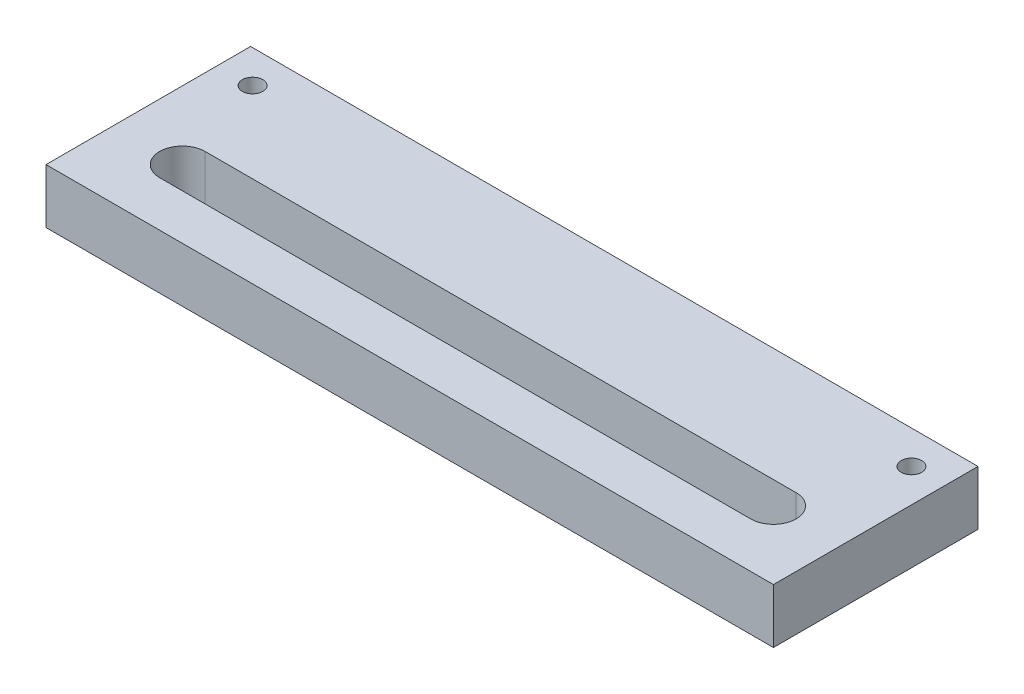
ISO-10303-21;
HEADER;
FILE_DESCRIPTION(('STEP AP214'),'2;1');
FILE_NAME('part.step','',(''),(''),'','','');
FILE_SCHEMA(('AUTOMOTIVE_DESIGN { 1 0 10303 214 1 1 1 1 }'));
ENDSEC;
DATA;
#1=APPLICATION_CONTEXT('core data for automotive mechanical design processes');
#2=APPLICATION_PROTOCOL_DEFINITION('international standard','automotive_design',2000,#1);
#3=PRODUCT_CONTEXT('',#1,'mechanical');
#4=PRODUCT('Part','Part','',(#3));
#5=PRODUCT_RELATED_PRODUCT_CATEGORY('part','',(#4));
#6=PRODUCT_DEFINITION_FORMATION('','',#4);
#7=PRODUCT_DEFINITION_CONTEXT('part definition',#1,'design');
#8=PRODUCT_DEFINITION('design','',#6,#7);
#9=PRODUCT_DEFINITION_SHAPE('','',#8);
#10=(LENGTH_UNIT() NAMED_UNIT(*) SI_UNIT(.MILLI.,.METRE.));
#11=(NAMED_UNIT(*) PLANE_ANGLE_UNIT() SI_UNIT($,.RADIAN.));
#12=(NAMED_UNIT(*) SI_UNIT($,.STERADIAN.) SOLID_ANGLE_UNIT());
#13=UNCERTAINTY_MEASURE_WITH_UNIT(LENGTH_MEASURE(1.E-05),#10,'distance_accuracy_value','');
#14=(GEOMETRIC_REPRESENTATION_CONTEXT(3) GLOBAL_UNCERTAINTY_ASSIGNED_CONTEXT((#13)) GLOBAL_UNIT_ASSIGNED_CONTEXT((#10,
#11,#12)) REPRESENTATION_CONTEXT('',''));
#15=CARTESIAN_POINT('',(0.,0.,0.));
#16=DIRECTION('',(0.,0.,1.));
#17=DIRECTION('',(1.,0.,0.));
#18=AXIS2_PLACEMENT_3D('',#15,#16,#17);
#19=CARTESIAN_POINT('',(0.,12.,0.));
#20=DIRECTION('',(-1.,0.,0.));
#21=DIRECTION('',(0.,0.,1.));
#22=AXIS2_PLACEMENT_3D('',#19,#20,#21);
#23=PLANE('',#22);
#24=DIRECTION('',(0.,0.,-1.));
#25=VECTOR('',#24,1.);
#26=CARTESIAN_POINT('',(0.,0.,0.));
#27=LINE('',#26,#25);
#28=CARTESIAN_POINT('',(0.,0.,45.));
#29=VERTEX_POINT('',#28);
#30=CARTESIAN_POINT('',(0.,0.,0.));
#31=VERTEX_POINT('',#30);
#32=EDGE_CURVE('E162',#29,#31,#27,.T.);
#33=ORIENTED_EDGE('',*,*,#32,.T.);
#34=DIRECTION('',(0.,-1.,0.));
#35=VECTOR('',#34,1.);
#36=CARTESIAN_POINT('',(0.,12.,0.));
#37=LINE('',#36,#35);
#38=CARTESIAN_POINT('',(0.,12.,0.));
#39=VERTEX_POINT('',#38);
#40=EDGE_CURVE('E11',#39,#31,#37,.T.);
#41=ORIENTED_EDGE('',*,*,#40,.F.);
#42=DIRECTION('',(0.,0.,-1.));
#43=VECTOR('',#42,1.);
#44=CARTESIAN_POINT('',(0.,12.,0.));
#45=LINE('',#44,#43);
#46=CARTESIAN_POINT('',(0.,12.,45.));
#47=VERTEX_POINT('',#46);
#48=EDGE_CURVE('E163',#47,#39,#45,.T.);
#49=ORIENTED_EDGE('',*,*,#48,.F.);
#50=DIRECTION('',(0.,-1.,0.));
#51=VECTOR('',#50,1.);
#52=CARTESIAN_POINT('',(0.,12.,45.));
#53=LINE('',#52,#51);
#54=EDGE_CURVE('E175',#47,#29,#53,.T.);
#55=ORIENTED_EDGE('',*,*,#54,.T.);
#56=EDGE_LOOP('',(#33,#41,#49,#55));
#57=FACE_BOUND('',#56,.T.);
#58=ADVANCED_FACE('F39',(#57),#23,.F.);
#59=CARTESIAN_POINT('',(0.,12.,0.));
#60=DIRECTION('',(0.,0.,1.));
#61=DIRECTION('',(1.,0.,0.));
#62=AXIS2_PLACEMENT_3D('',#59,#60,#61);
#63=PLANE('',#62);
#64=DIRECTION('',(-1.,0.,0.));
#65=VECTOR('',#64,1.);
#66=CARTESIAN_POINT('',(0.,0.,0.));
#67=LINE('',#66,#65);
#68=CARTESIAN_POINT('',(-160.,0.,0.));
#69=VERTEX_POINT('',#68);
#70=EDGE_CURVE('E177',#31,#69,#67,.T.);
#71=ORIENTED_EDGE('',*,*,#70,.T.);
#72=DIRECTION('',(0.,-1.,0.));
#73=VECTOR('',#72,1.);
#74=CARTESIAN_POINT('',(-160.,12.,0.));
#75=LINE('',#74,#73);
#76=CARTESIAN_POINT('',(-160.,12.,0.));
#77=VERTEX_POINT('',#76);
#78=EDGE_CURVE('E46',#77,#69,#75,.T.);
#79=ORIENTED_EDGE('',*,*,#78,.F.);
#80=DIRECTION('',(-1.,0.,0.));
#81=VECTOR('',#80,1.);
#82=CARTESIAN_POINT('',(0.,12.,0.));
#83=LINE('',#82,#81);
#84=EDGE_CURVE('E170',#39,#77,#83,.T.);
#85=ORIENTED_EDGE('',*,*,#84,.F.);
#86=ORIENTED_EDGE('',*,*,#40,.T.);
#87=EDGE_LOOP('',(#71,#79,#85,#86));
#88=FACE_BOUND('',#87,.T.);
#89=ADVANCED_FACE('F206',(#88),#63,.F.);
#90=CARTESIAN_POINT('',(-160.,12.,0.));
#91=DIRECTION('',(1.,0.,0.));
#92=DIRECTION('',(0.,0.,-1.));
#93=AXIS2_PLACEMENT_3D('',#90,#91,#92);
#94=PLANE('',#93);
#95=DIRECTION('',(0.,0.,1.));
#96=VECTOR('',#95,1.);
#97=CARTESIAN_POINT('',(-160.,0.,0.));
#98=LINE('',#97,#96);
#99=CARTESIAN_POINT('',(-160.,0.,45.));
#100=VERTEX_POINT('',#99);
#101=EDGE_CURVE('E178',#69,#100,#98,.T.);
#102=ORIENTED_EDGE('',*,*,#101,.T.);
#103=DIRECTION('',(0.,-1.,0.));
#104=VECTOR('',#103,1.);
#105=CARTESIAN_POINT('',(-160.,12.,45.));
#106=LINE('',#105,#104);
#107=CARTESIAN_POINT('',(-160.,12.,45.));
#108=VERTEX_POINT('',#107);
#109=EDGE_CURVE('E184',#108,#100,#106,.T.);
#110=ORIENTED_EDGE('',*,*,#109,.F.);
#111=DIRECTION('',(0.,0.,1.));
#112=VECTOR('',#111,1.);
#113=CARTESIAN_POINT('',(-160.,12.,0.));
#114=LINE('',#113,#112);
#115=EDGE_CURVE('E168',#77,#108,#114,.T.);
#116=ORIENTED_EDGE('',*,*,#115,.F.);
#117=ORIENTED_EDGE('',*,*,#78,.T.);
#118=EDGE_LOOP('',(#102,#110,#116,#117));
#119=FACE_BOUND('',#118,.T.);
#120=ADVANCED_FACE('F191',(#119),#94,.F.);
#121=CARTESIAN_POINT('',(0.,12.,45.));
#122=DIRECTION('',(0.,0.,-1.));
#123=DIRECTION('',(-1.,0.,0.));
#124=AXIS2_PLACEMENT_3D('',#121,#122,#123);
#125=PLANE('',#124);
#126=DIRECTION('',(1.,0.,0.));
#127=VECTOR('',#126,1.);
#128=CARTESIAN_POINT('',(0.,0.,45.));
#129=LINE('',#128,#127);
#130=EDGE_CURVE('E169',#100,#29,#129,.T.);
#131=ORIENTED_EDGE('',*,*,#130,.T.);
#132=ORIENTED_EDGE('',*,*,#54,.F.);
#133=DIRECTION('',(1.,0.,0.));
#134=VECTOR('',#133,1.);
#135=CARTESIAN_POINT('',(0.,12.,45.));
#136=LINE('',#135,#134);
#137=EDGE_CURVE('E174',#108,#47,#136,.T.);
#138=ORIENTED_EDGE('',*,*,#137,.F.);
#139=ORIENTED_EDGE('',*,*,#109,.T.);
#140=EDGE_LOOP('',(#131,#132,#138,#139));
#141=FACE_BOUND('',#140,.T.);
#142=ADVANCED_FACE('F199',(#141),#125,.F.);
#143=CARTESIAN_POINT('',(0.,12.,0.));
#144=DIRECTION('',(0.,-1.,0.));
#145=DIRECTION('',(0.,0.,-1.));
#146=AXIS2_PLACEMENT_3D('',#143,#144,#145);
#147=PLANE('',#146);
#148=DIRECTION('',(1.,0.,0.));
#149=VECTOR('',#148,1.);
#150=CARTESIAN_POINT('',(0.,12.,35.));
#151=LINE('',#150,#149);
#152=CARTESIAN_POINT('',(-145.,12.,35.));
#153=VERTEX_POINT('',#152);
#154=CARTESIAN_POINT('',(-15.,12.,35.));
#155=VERTEX_POINT('',#154);
#156=EDGE_CURVE('E115',#153,#155,#151,.T.);
#157=ORIENTED_EDGE('',*,*,#156,.F.);
#158=CARTESIAN_POINT('',(-145.,12.,30.));
#159=DIRECTION('',(0.,-1.,0.));
#160=DIRECTION('',(0.,0.,-1.));
#161=AXIS2_PLACEMENT_3D('',#158,#159,#160);
#162=CIRCLE('',#161,4.99999999999999);
#163=CARTESIAN_POINT('',(-145.,12.,25.));
#164=VERTEX_POINT('',#163);
#165=EDGE_CURVE('E106',#153,#164,#162,.T.);
#166=ORIENTED_EDGE('',*,*,#165,.T.);
#167=DIRECTION('',(1.,0.,0.));
#168=VECTOR('',#167,1.);
#169=CARTESIAN_POINT('',(0.,12.,25.));
#170=LINE('',#169,#168);
#171=CARTESIAN_POINT('',(-15.,12.,25.));
#172=VERTEX_POINT('',#171);
#173=EDGE_CURVE('E113',#164,#172,#170,.T.);
#174=ORIENTED_EDGE('',*,*,#173,.T.);
#175=CARTESIAN_POINT('',(-15.,12.,30.));
#176=DIRECTION('',(0.,-1.,0.));
#177=DIRECTION('',(0.,0.,-1.));
#178=AXIS2_PLACEMENT_3D('',#175,#176,#177);
#179=CIRCLE('',#178,5.);
#180=EDGE_CURVE('E52',#172,#155,#179,.T.);
#181=ORIENTED_EDGE('',*,*,#180,.T.);
#182=EDGE_LOOP('',(#157,#166,#174,#181));
#183=FACE_BOUND('',#182,.T.);
#184=CARTESIAN_POINT('',(-7.31995414508143,12.,7.31999042270609));
#185=DIRECTION('',(0.,-1.,0.));
#186=DIRECTION('',(0.,0.,-1.));
#187=AXIS2_PLACEMENT_3D('',#184,#185,#186);
#188=CIRCLE('',#187,2.25);
#189=CARTESIAN_POINT('',(-7.31995414508143,12.,5.06999042270609));
#190=VERTEX_POINT('',#189);
#191=EDGE_CURVE('E146',#190,#190,#188,.T.);
#192=ORIENTED_EDGE('',*,*,#191,.T.);
#193=EDGE_LOOP('',(#192));
#194=FACE_BOUND('',#193,.T.);
#195=CARTESIAN_POINT('',(-152.33485324377,12.,7.22227352133084));
#196=DIRECTION('',(0.,-1.,0.));
#197=DIRECTION('',(0.,0.,-1.));
#198=AXIS2_PLACEMENT_3D('',#195,#196,#197);
#199=CIRCLE('',#198,2.25);
#200=CARTESIAN_POINT('',(-152.33485324377,12.,4.97227352133084));
#201=VERTEX_POINT('',#200);
#202=EDGE_CURVE('E159',#201,#201,#199,.T.);
#203=ORIENTED_EDGE('',*,*,#202,.T.);
#204=EDGE_LOOP('',(#203));
#205=FACE_BOUND('',#204,.T.);
#206=ORIENTED_EDGE('',*,*,#48,.T.);
#207=ORIENTED_EDGE('',*,*,#84,.T.);
#208=ORIENTED_EDGE('',*,*,#115,.T.);
#209=ORIENTED_EDGE('',*,*,#137,.T.);
#210=EDGE_LOOP('',(#206,#207,#208,#209));
#211=FACE_BOUND('',#210,.T.);
#212=ADVANCED_FACE('F120',(#183,#194,#205,#211),#147,.F.);
#213=CARTESIAN_POINT('',(0.,0.,0.));
#214=DIRECTION('',(0.,-1.,0.));
#215=DIRECTION('',(0.,0.,-1.));
#216=AXIS2_PLACEMENT_3D('',#213,#214,#215);
#217=PLANE('',#216);
#218=CARTESIAN_POINT('',(-145.,0.,30.));
#219=DIRECTION('',(0.,-1.,0.));
#220=DIRECTION('',(0.,0.,-1.));
#221=AXIS2_PLACEMENT_3D('',#218,#219,#220);
#222=CIRCLE('',#221,4.99999999999999);
#223=CARTESIAN_POINT('',(-145.,0.,35.));
#224=VERTEX_POINT('',#223);
#225=CARTESIAN_POINT('',(-145.,0.,25.));
#226=VERTEX_POINT('',#225);
#227=EDGE_CURVE('E63',#224,#226,#222,.T.);
#228=ORIENTED_EDGE('',*,*,#227,.F.);
#229=DIRECTION('',(1.,0.,0.));
#230=VECTOR('',#229,1.);
#231=CARTESIAN_POINT('',(0.,0.,35.));
#232=LINE('',#231,#230);
#233=CARTESIAN_POINT('',(-15.,0.,35.));
#234=VERTEX_POINT('',#233);
#235=EDGE_CURVE('E121',#224,#234,#232,.T.);
#236=ORIENTED_EDGE('',*,*,#235,.T.);
#237=CARTESIAN_POINT('',(-15.,0.,30.));
#238=DIRECTION('',(0.,-1.,0.));
#239=DIRECTION('',(0.,0.,-1.));
#240=AXIS2_PLACEMENT_3D('',#237,#238,#239);
#241=CIRCLE('',#240,5.);
#242=CARTESIAN_POINT('',(-15.,0.,25.));
#243=VERTEX_POINT('',#242);
#244=EDGE_CURVE('E123',#243,#234,#241,.T.);
#245=ORIENTED_EDGE('',*,*,#244,.F.);
#246=DIRECTION('',(1.,0.,0.));
#247=VECTOR('',#246,1.);
#248=CARTESIAN_POINT('',(0.,0.,25.));
#249=LINE('',#248,#247);
#250=EDGE_CURVE('E128',#226,#243,#249,.T.);
#251=ORIENTED_EDGE('',*,*,#250,.F.);
#252=EDGE_LOOP('',(#228,#236,#245,#251));
#253=FACE_BOUND('',#252,.T.);
#254=CARTESIAN_POINT('',(-7.31995414508143,0.,7.31999042270609));
#255=DIRECTION('',(0.,-1.,0.));
#256=DIRECTION('',(0.,0.,-1.));
#257=AXIS2_PLACEMENT_3D('',#254,#255,#256);
#258=CIRCLE('',#257,4.99999999999999);
#259=CARTESIAN_POINT('',(-7.31995414508143,0.,2.3199904227061));
#260=VERTEX_POINT('',#259);
#261=EDGE_CURVE('E136',#260,#260,#258,.T.);
#262=ORIENTED_EDGE('',*,*,#261,.F.);
#263=EDGE_LOOP('',(#262));
#264=FACE_BOUND('',#263,.T.);
#265=CARTESIAN_POINT('',(-152.33485324377,0.,7.22227352133084));
#266=DIRECTION('',(0.,-1.,0.));
#267=DIRECTION('',(0.,0.,-1.));
#268=AXIS2_PLACEMENT_3D('',#265,#266,#267);
#269=CIRCLE('',#268,5.);
#270=CARTESIAN_POINT('',(-152.33485324377,0.,2.22227352133084));
#271=VERTEX_POINT('',#270);
#272=EDGE_CURVE('E151',#271,#271,#269,.T.);
#273=ORIENTED_EDGE('',*,*,#272,.F.);
#274=EDGE_LOOP('',(#273));
#275=FACE_BOUND('',#274,.T.);
#276=ORIENTED_EDGE('',*,*,#32,.F.);
#277=ORIENTED_EDGE('',*,*,#130,.F.);
#278=ORIENTED_EDGE('',*,*,#101,.F.);
#279=ORIENTED_EDGE('',*,*,#70,.F.);
#280=EDGE_LOOP('',(#276,#277,#278,#279));
#281=FACE_BOUND('',#280,.T.);
#282=ADVANCED_FACE('F197',(#253,#264,#275,#281),#217,.T.);
#283=CARTESIAN_POINT('',(-152.33485324377,0.,7.22227352133084));
#284=DIRECTION('',(0.,-1.,0.));
#285=DIRECTION('',(0.,0.,-1.));
#286=AXIS2_PLACEMENT_3D('',#283,#284,#285);
#287=CYLINDRICAL_SURFACE('',#286,2.25);
#288=ORIENTED_EDGE('',*,*,#202,.F.);
#289=EDGE_LOOP('',(#288));
#290=FACE_BOUND('',#289,.T.);
#291=CARTESIAN_POINT('',(-152.33485324377,5.,7.22227352133084));
#292=DIRECTION('',(0.,-1.,0.));
#293=DIRECTION('',(0.,0.,-1.));
#294=AXIS2_PLACEMENT_3D('',#291,#292,#293);
#295=CIRCLE('',#294,2.25);
#296=CARTESIAN_POINT('',(-152.33485324377,5.,4.97227352133084));
#297=VERTEX_POINT('',#296);
#298=EDGE_CURVE('E160',#297,#297,#295,.T.);
#299=ORIENTED_EDGE('',*,*,#298,.T.);
#300=EDGE_LOOP('',(#299));
#301=FACE_BOUND('',#300,.T.);
#302=ADVANCED_FACE('F217',(#290,#301),#287,.F.);
#303=CARTESIAN_POINT('',(-150.08485324377,5.,7.22227352133084));
#304=DIRECTION('',(0.,1.,0.));
#305=DIRECTION('',(0.,0.,1.));
#306=AXIS2_PLACEMENT_3D('',#303,#304,#305);
#307=PLANE('',#306);
#308=ORIENTED_EDGE('',*,*,#298,.F.);
#309=EDGE_LOOP('',(#308));
#310=FACE_BOUND('',#309,.T.);
#311=CARTESIAN_POINT('',(-152.33485324377,5.,7.22227352133084));
#312=DIRECTION('',(0.,-1.,0.));
#313=DIRECTION('',(0.,0.,-1.));
#314=AXIS2_PLACEMENT_3D('',#311,#312,#313);
#315=CIRCLE('',#314,5.);
#316=CARTESIAN_POINT('',(-152.33485324377,5.,2.22227352133084));
#317=VERTEX_POINT('',#316);
#318=EDGE_CURVE('E152',#317,#317,#315,.T.);
#319=ORIENTED_EDGE('',*,*,#318,.T.);
#320=EDGE_LOOP('',(#319));
#321=FACE_BOUND('',#320,.T.);
#322=ADVANCED_FACE('F221',(#310,#321),#307,.F.);
#323=CARTESIAN_POINT('',(-152.33485324377,0.,7.22227352133084));
#324=DIRECTION('',(0.,-1.,0.));
#325=DIRECTION('',(0.,0.,-1.));
#326=AXIS2_PLACEMENT_3D('',#323,#324,#325);
#327=CYLINDRICAL_SURFACE('',#326,5.);
#328=ORIENTED_EDGE('',*,*,#318,.F.);
#329=EDGE_LOOP('',(#328));
#330=FACE_BOUND('',#329,.T.);
#331=ORIENTED_EDGE('',*,*,#272,.T.);
#332=EDGE_LOOP('',(#331));
#333=FACE_BOUND('',#332,.T.);
#334=ADVANCED_FACE('F227',(#330,#333),#327,.F.);
#335=CARTESIAN_POINT('',(-7.31995414508143,0.,7.31999042270609));
#336=DIRECTION('',(0.,-1.,0.));
#337=DIRECTION('',(0.,0.,-1.));
#338=AXIS2_PLACEMENT_3D('',#335,#336,#337);
#339=CYLINDRICAL_SURFACE('',#338,2.25);
#340=ORIENTED_EDGE('',*,*,#191,.F.);
#341=EDGE_LOOP('',(#340));
#342=FACE_BOUND('',#341,.T.);
#343=CARTESIAN_POINT('',(-7.31995414508143,5.,7.31999042270609));
#344=DIRECTION('',(0.,-1.,0.));
#345=DIRECTION('',(0.,0.,-1.));
#346=AXIS2_PLACEMENT_3D('',#343,#344,#345);
#347=CIRCLE('',#346,2.25000000000001);
#348=CARTESIAN_POINT('',(-7.31995414508143,5.,5.06999042270608));
#349=VERTEX_POINT('',#348);
#350=EDGE_CURVE('E144',#349,#349,#347,.T.);
#351=ORIENTED_EDGE('',*,*,#350,.T.);
#352=EDGE_LOOP('',(#351));
#353=FACE_BOUND('',#352,.T.);
#354=ADVANCED_FACE('F232',(#342,#353),#339,.F.);
#355=CARTESIAN_POINT('',(-5.06995414508142,5.,7.31999042270609));
#356=DIRECTION('',(0.,1.,0.));
#357=DIRECTION('',(0.,0.,1.));
#358=AXIS2_PLACEMENT_3D('',#355,#356,#357);
#359=PLANE('',#358);
#360=ORIENTED_EDGE('',*,*,#350,.F.);
#361=EDGE_LOOP('',(#360));
#362=FACE_BOUND('',#361,.T.);
#363=CARTESIAN_POINT('',(-7.31995414508143,5.,7.31999042270609));
#364=DIRECTION('',(0.,-1.,0.));
#365=DIRECTION('',(0.,0.,-1.));
#366=AXIS2_PLACEMENT_3D('',#363,#364,#365);
#367=CIRCLE('',#366,4.99999999999999);
#368=CARTESIAN_POINT('',(-7.31995414508143,5.,2.3199904227061));
#369=VERTEX_POINT('',#368);
#370=EDGE_CURVE('E142',#369,#369,#367,.T.);
#371=ORIENTED_EDGE('',*,*,#370,.T.);
#372=EDGE_LOOP('',(#371));
#373=FACE_BOUND('',#372,.T.);
#374=ADVANCED_FACE('F237',(#362,#373),#359,.F.);
#375=CARTESIAN_POINT('',(-7.31995414508143,0.,7.31999042270609));
#376=DIRECTION('',(0.,-1.,0.));
#377=DIRECTION('',(0.,0.,-1.));
#378=AXIS2_PLACEMENT_3D('',#375,#376,#377);
#379=CYLINDRICAL_SURFACE('',#378,4.99999999999999);
#380=ORIENTED_EDGE('',*,*,#370,.F.);
#381=EDGE_LOOP('',(#380));
#382=FACE_BOUND('',#381,.T.);
#383=ORIENTED_EDGE('',*,*,#261,.T.);
#384=EDGE_LOOP('',(#383));
#385=FACE_BOUND('',#384,.T.);
#386=ADVANCED_FACE('F238',(#382,#385),#379,.F.);
#387=CARTESIAN_POINT('',(-145.,12.,30.));
#388=DIRECTION('',(0.,-1.,0.));
#389=DIRECTION('',(0.,0.,-1.));
#390=AXIS2_PLACEMENT_3D('',#387,#388,#389);
#391=CYLINDRICAL_SURFACE('',#390,4.99999999999999);
#392=ORIENTED_EDGE('',*,*,#227,.T.);
#393=DIRECTION('',(0.,-1.,0.));
#394=VECTOR('',#393,1.);
#395=CARTESIAN_POINT('',(-145.,12.,25.));
#396=LINE('',#395,#394);
#397=EDGE_CURVE('E105',#164,#226,#396,.T.);
#398=ORIENTED_EDGE('',*,*,#397,.F.);
#399=ORIENTED_EDGE('',*,*,#165,.F.);
#400=DIRECTION('',(0.,-1.,0.));
#401=VECTOR('',#400,1.);
#402=CARTESIAN_POINT('',(-145.,12.,35.));
#403=LINE('',#402,#401);
#404=EDGE_CURVE('E135',#153,#224,#403,.T.);
#405=ORIENTED_EDGE('',*,*,#404,.T.);
#406=EDGE_LOOP('',(#392,#398,#399,#405));
#407=FACE_BOUND('',#406,.T.);
#408=ADVANCED_FACE('F102',(#407),#391,.F.);
#409=CARTESIAN_POINT('',(0.,12.,35.));
#410=DIRECTION('',(0.,0.,-1.));
#411=DIRECTION('',(-1.,0.,0.));
#412=AXIS2_PLACEMENT_3D('',#409,#410,#411);
#413=PLANE('',#412);
#414=ORIENTED_EDGE('',*,*,#235,.F.);
#415=ORIENTED_EDGE('',*,*,#404,.F.);
#416=ORIENTED_EDGE('',*,*,#156,.T.);
#417=DIRECTION('',(0.,-1.,0.));
#418=VECTOR('',#417,1.);
#419=CARTESIAN_POINT('',(-15.,12.,35.));
#420=LINE('',#419,#418);
#421=EDGE_CURVE('E137',#155,#234,#420,.T.);
#422=ORIENTED_EDGE('',*,*,#421,.T.);
#423=EDGE_LOOP('',(#414,#415,#416,#422));
#424=FACE_BOUND('',#423,.T.);
#425=ADVANCED_FACE('F247',(#424),#413,.T.);
#426=CARTESIAN_POINT('',(-15.,12.,30.));
#427=DIRECTION('',(0.,-1.,0.));
#428=DIRECTION('',(0.,0.,-1.));
#429=AXIS2_PLACEMENT_3D('',#426,#427,#428);
#430=CYLINDRICAL_SURFACE('',#429,5.);
#431=ORIENTED_EDGE('',*,*,#244,.T.);
#432=ORIENTED_EDGE('',*,*,#421,.F.);
#433=ORIENTED_EDGE('',*,*,#180,.F.);
#434=DIRECTION('',(0.,-1.,0.));
#435=VECTOR('',#434,1.);
#436=CARTESIAN_POINT('',(-15.,12.,25.));
#437=LINE('',#436,#435);
#438=EDGE_CURVE('E112',#172,#243,#437,.T.);
#439=ORIENTED_EDGE('',*,*,#438,.T.);
#440=EDGE_LOOP('',(#431,#432,#433,#439));
#441=FACE_BOUND('',#440,.T.);
#442=ADVANCED_FACE('F250',(#441),#430,.F.);
#443=CARTESIAN_POINT('',(0.,12.,25.));
#444=DIRECTION('',(0.,0.,-1.));
#445=DIRECTION('',(-1.,0.,0.));
#446=AXIS2_PLACEMENT_3D('',#443,#444,#445);
#447=PLANE('',#446);
#448=ORIENTED_EDGE('',*,*,#250,.T.);
#449=ORIENTED_EDGE('',*,*,#438,.F.);
#450=ORIENTED_EDGE('',*,*,#173,.F.);
#451=ORIENTED_EDGE('',*,*,#397,.T.);
#452=EDGE_LOOP('',(#448,#449,#450,#451));
#453=FACE_BOUND('',#452,.T.);
#454=ADVANCED_FACE('F118',(#453),#447,.F.);
#455=CLOSED_SHELL('',(#58,#89,#120,#142,#212,#282,#302,#322,#334,#354,#374,#386,#408,#425,#442,#454));
#456=MANIFOLD_SOLID_BREP('B2',#455);
#457=ADVANCED_BREP_SHAPE_REPRESENTATION('',(#18,#456),#14);
#458=SHAPE_DEFINITION_REPRESENTATION(#9,#457);
ENDSEC;
END-ISO-10303-21;
